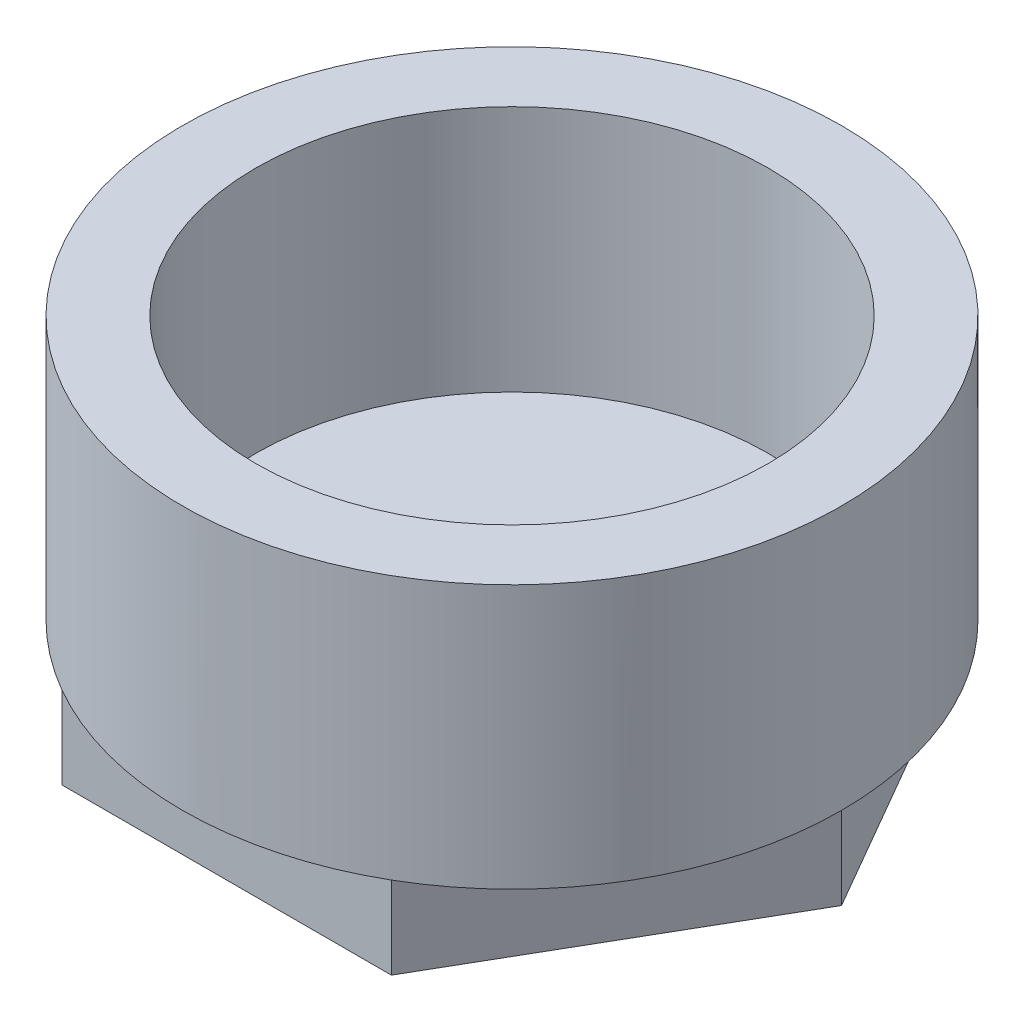
ISO-10303-21;
HEADER;
FILE_DESCRIPTION(('STEP AP214'),'2;1');
FILE_NAME('part.step','',(''),(''),'','','');
FILE_SCHEMA(('AUTOMOTIVE_DESIGN { 1 0 10303 214 1 1 1 1 }'));
ENDSEC;
DATA;
#1=APPLICATION_CONTEXT('core data for automotive mechanical design processes');
#2=APPLICATION_PROTOCOL_DEFINITION('international standard','automotive_design',2000,#1);
#3=PRODUCT_CONTEXT('',#1,'mechanical');
#4=PRODUCT('Part','Part','',(#3));
#5=PRODUCT_RELATED_PRODUCT_CATEGORY('part','',(#4));
#6=PRODUCT_DEFINITION_FORMATION('','',#4);
#7=PRODUCT_DEFINITION_CONTEXT('part definition',#1,'design');
#8=PRODUCT_DEFINITION('design','',#6,#7);
#9=PRODUCT_DEFINITION_SHAPE('','',#8);
#10=(LENGTH_UNIT() NAMED_UNIT(*) SI_UNIT(.MILLI.,.METRE.));
#11=(NAMED_UNIT(*) PLANE_ANGLE_UNIT() SI_UNIT($,.RADIAN.));
#12=(NAMED_UNIT(*) SI_UNIT($,.STERADIAN.) SOLID_ANGLE_UNIT());
#13=UNCERTAINTY_MEASURE_WITH_UNIT(LENGTH_MEASURE(1.E-05),#10,'distance_accuracy_value','');
#14=(GEOMETRIC_REPRESENTATION_CONTEXT(3) GLOBAL_UNCERTAINTY_ASSIGNED_CONTEXT((#13)) GLOBAL_UNIT_ASSIGNED_CONTEXT((#10,
#11,#12)) REPRESENTATION_CONTEXT('',''));
#15=CARTESIAN_POINT('',(0.,0.,0.));
#16=DIRECTION('',(0.,0.,1.));
#17=DIRECTION('',(1.,0.,0.));
#18=AXIS2_PLACEMENT_3D('',#15,#16,#17);
#19=CARTESIAN_POINT('',(0.,0.,0.));
#20=DIRECTION('',(0.,-1.,0.));
#21=DIRECTION('',(0.,0.,-1.));
#22=AXIS2_PLACEMENT_3D('',#19,#20,#21);
#23=CYLINDRICAL_SURFACE('',#22,20.);
#24=CARTESIAN_POINT('',(0.,21.,0.));
#25=DIRECTION('',(0.,-1.,0.));
#26=DIRECTION('',(0.,0.,-1.));
#27=AXIS2_PLACEMENT_3D('',#24,#25,#26);
#28=CIRCLE('',#27,20.);
#29=CARTESIAN_POINT('',(0.,21.,-20.));
#30=VERTEX_POINT('',#29);
#31=EDGE_CURVE('E11',#30,#30,#28,.T.);
#32=ORIENTED_EDGE('',*,*,#31,.T.);
#33=EDGE_LOOP('',(#32));
#34=FACE_BOUND('',#33,.T.);
#35=CARTESIAN_POINT('',(0.,5.,0.));
#36=DIRECTION('',(0.,-1.,0.));
#37=DIRECTION('',(0.,0.,-1.));
#38=AXIS2_PLACEMENT_3D('',#35,#36,#37);
#39=CIRCLE('',#38,20.);
#40=CARTESIAN_POINT('',(10.,5.,-17.3205080756888));
#41=VERTEX_POINT('',#40);
#42=CARTESIAN_POINT('',(20.,5.,0.));
#43=VERTEX_POINT('',#42);
#44=EDGE_CURVE('E106',#41,#43,#39,.T.);
#45=ORIENTED_EDGE('',*,*,#44,.F.);
#46=CARTESIAN_POINT('',(0.,5.,0.));
#47=DIRECTION('',(0.,-1.,0.));
#48=DIRECTION('',(0.,0.,-1.));
#49=AXIS2_PLACEMENT_3D('',#46,#47,#48);
#50=CIRCLE('',#49,20.);
#51=CARTESIAN_POINT('',(-10.,5.,-17.3205080756888));
#52=VERTEX_POINT('',#51);
#53=EDGE_CURVE('E115',#52,#41,#50,.T.);
#54=ORIENTED_EDGE('',*,*,#53,.F.);
#55=CARTESIAN_POINT('',(0.,5.,0.));
#56=DIRECTION('',(0.,-1.,0.));
#57=DIRECTION('',(0.,0.,-1.));
#58=AXIS2_PLACEMENT_3D('',#55,#56,#57);
#59=CIRCLE('',#58,20.);
#60=CARTESIAN_POINT('',(-20.,5.,0.));
#61=VERTEX_POINT('',#60);
#62=EDGE_CURVE('E342',#61,#52,#59,.T.);
#63=ORIENTED_EDGE('',*,*,#62,.F.);
#64=CARTESIAN_POINT('',(0.,5.,0.));
#65=DIRECTION('',(0.,-1.,0.));
#66=DIRECTION('',(0.,0.,-1.));
#67=AXIS2_PLACEMENT_3D('',#64,#65,#66);
#68=CIRCLE('',#67,20.);
#69=CARTESIAN_POINT('',(-10.,5.,17.3205080756888));
#70=VERTEX_POINT('',#69);
#71=EDGE_CURVE('E134',#70,#61,#68,.T.);
#72=ORIENTED_EDGE('',*,*,#71,.F.);
#73=CARTESIAN_POINT('',(0.,5.,0.));
#74=DIRECTION('',(0.,-1.,0.));
#75=DIRECTION('',(0.,0.,-1.));
#76=AXIS2_PLACEMENT_3D('',#73,#74,#75);
#77=CIRCLE('',#76,20.);
#78=CARTESIAN_POINT('',(10.,5.,17.3205080756888));
#79=VERTEX_POINT('',#78);
#80=EDGE_CURVE('E330',#79,#70,#77,.T.);
#81=ORIENTED_EDGE('',*,*,#80,.F.);
#82=CARTESIAN_POINT('',(0.,5.,0.));
#83=DIRECTION('',(0.,-1.,0.));
#84=DIRECTION('',(0.,0.,-1.));
#85=AXIS2_PLACEMENT_3D('',#82,#83,#84);
#86=CIRCLE('',#85,20.);
#87=EDGE_CURVE('E118',#43,#79,#86,.T.);
#88=ORIENTED_EDGE('',*,*,#87,.F.);
#89=EDGE_LOOP('',(#45,#54,#63,#72,#81,#88));
#90=FACE_BOUND('',#89,.T.);
#91=ADVANCED_FACE('F39',(#34,#90),#23,.T.);
#92=CARTESIAN_POINT('',(0.,0.,0.));
#93=DIRECTION('',(0.,1.,0.));
#94=DIRECTION('',(0.,0.,1.));
#95=AXIS2_PLACEMENT_3D('',#92,#93,#94);
#96=PLANE('',#95);
#97=CARTESIAN_POINT('',(0.,0.,0.));
#98=DIRECTION('',(0.,-1.,0.));
#99=DIRECTION('',(0.,0.,-1.));
#100=AXIS2_PLACEMENT_3D('',#97,#98,#99);
#101=CIRCLE('',#100,3.175);
#102=CARTESIAN_POINT('',(0.,0.,-3.175));
#103=VERTEX_POINT('',#102);
#104=EDGE_CURVE('E145',#103,#103,#101,.T.);
#105=ORIENTED_EDGE('',*,*,#104,.F.);
#106=EDGE_LOOP('',(#105));
#107=FACE_BOUND('',#106,.T.);
#108=CARTESIAN_POINT('',(10.,0.,0.));
#109=DIRECTION('',(0.,-1.,0.));
#110=DIRECTION('',(0.,0.,-1.));
#111=AXIS2_PLACEMENT_3D('',#108,#109,#110);
#112=CIRCLE('',#111,0.500000000000001);
#113=CARTESIAN_POINT('',(10.,0.,-0.500000000000001));
#114=VERTEX_POINT('',#113);
#115=EDGE_CURVE('E132',#114,#114,#112,.T.);
#116=ORIENTED_EDGE('',*,*,#115,.F.);
#117=EDGE_LOOP('',(#116));
#118=FACE_BOUND('',#117,.T.);
#119=DIRECTION('',(-1.,0.,0.));
#120=VECTOR('',#119,1.);
#121=CARTESIAN_POINT('',(0.,0.,-17.3205080756888));
#122=LINE('',#121,#120);
#123=CARTESIAN_POINT('',(10.,0.,-17.3205080756888));
#124=VERTEX_POINT('',#123);
#125=CARTESIAN_POINT('',(-10.,0.,-17.3205080756888));
#126=VERTEX_POINT('',#125);
#127=EDGE_CURVE('E124',#124,#126,#122,.T.);
#128=ORIENTED_EDGE('',*,*,#127,.F.);
#129=DIRECTION('',(-0.5,0.,-0.866025403784439));
#130=VECTOR('',#129,1.);
#131=CARTESIAN_POINT('',(15.,0.,-8.66025403784439));
#132=LINE('',#131,#130);
#133=CARTESIAN_POINT('',(20.,0.,0.));
#134=VERTEX_POINT('',#133);
#135=EDGE_CURVE('E95',#134,#124,#132,.T.);
#136=ORIENTED_EDGE('',*,*,#135,.F.);
#137=DIRECTION('',(0.5,0.,-0.866025403784439));
#138=VECTOR('',#137,1.);
#139=CARTESIAN_POINT('',(15.,0.,8.66025403784439));
#140=LINE('',#139,#138);
#141=CARTESIAN_POINT('',(10.,0.,17.3205080756888));
#142=VERTEX_POINT('',#141);
#143=EDGE_CURVE('E354',#142,#134,#140,.T.);
#144=ORIENTED_EDGE('',*,*,#143,.F.);
#145=DIRECTION('',(1.,0.,0.));
#146=VECTOR('',#145,1.);
#147=CARTESIAN_POINT('',(0.,0.,17.3205080756888));
#148=LINE('',#147,#146);
#149=CARTESIAN_POINT('',(-10.,0.,17.3205080756888));
#150=VERTEX_POINT('',#149);
#151=EDGE_CURVE('E108',#150,#142,#148,.T.);
#152=ORIENTED_EDGE('',*,*,#151,.F.);
#153=DIRECTION('',(0.5,0.,0.866025403784439));
#154=VECTOR('',#153,1.);
#155=CARTESIAN_POINT('',(-15.,0.,8.66025403784439));
#156=LINE('',#155,#154);
#157=CARTESIAN_POINT('',(-20.,0.,0.));
#158=VERTEX_POINT('',#157);
#159=EDGE_CURVE('E138',#158,#150,#156,.T.);
#160=ORIENTED_EDGE('',*,*,#159,.F.);
#161=DIRECTION('',(-0.5,0.,0.866025403784439));
#162=VECTOR('',#161,1.);
#163=CARTESIAN_POINT('',(-15.,0.,-8.66025403784439));
#164=LINE('',#163,#162);
#165=EDGE_CURVE('E64',#126,#158,#164,.T.);
#166=ORIENTED_EDGE('',*,*,#165,.F.);
#167=EDGE_LOOP('',(#128,#136,#144,#152,#160,#166));
#168=FACE_BOUND('',#167,.T.);
#169=ADVANCED_FACE('F41',(#107,#118,#168),#96,.F.);
#170=CARTESIAN_POINT('',(-20.,21.,0.));
#171=DIRECTION('',(0.,-1.,0.));
#172=DIRECTION('',(0.,0.,-1.));
#173=AXIS2_PLACEMENT_3D('',#170,#171,#172);
#174=PLANE('',#173);
#175=ORIENTED_EDGE('',*,*,#31,.F.);
#176=EDGE_LOOP('',(#175));
#177=FACE_BOUND('',#176,.T.);
#178=CARTESIAN_POINT('',(0.,21.,0.));
#179=DIRECTION('',(0.,-1.,0.));
#180=DIRECTION('',(0.,0.,-1.));
#181=AXIS2_PLACEMENT_3D('',#178,#179,#180);
#182=CIRCLE('',#181,15.5465);
#183=CARTESIAN_POINT('',(0.,21.,-15.5465));
#184=VERTEX_POINT('',#183);
#185=EDGE_CURVE('E48',#184,#184,#182,.T.);
#186=ORIENTED_EDGE('',*,*,#185,.T.);
#187=EDGE_LOOP('',(#186));
#188=FACE_BOUND('',#187,.T.);
#189=ADVANCED_FACE('F181',(#177,#188),#174,.F.);
#190=CARTESIAN_POINT('',(0.,0.,0.));
#191=DIRECTION('',(0.,-1.,0.));
#192=DIRECTION('',(0.,0.,-1.));
#193=AXIS2_PLACEMENT_3D('',#190,#191,#192);
#194=CYLINDRICAL_SURFACE('',#193,15.5465);
#195=ORIENTED_EDGE('',*,*,#185,.F.);
#196=EDGE_LOOP('',(#195));
#197=FACE_BOUND('',#196,.T.);
#198=CARTESIAN_POINT('',(0.,6.,0.));
#199=DIRECTION('',(0.,-1.,0.));
#200=DIRECTION('',(0.,0.,-1.));
#201=AXIS2_PLACEMENT_3D('',#198,#199,#200);
#202=CIRCLE('',#201,15.5465);
#203=CARTESIAN_POINT('',(0.,6.,-15.5465));
#204=VERTEX_POINT('',#203);
#205=EDGE_CURVE('E151',#204,#204,#202,.T.);
#206=ORIENTED_EDGE('',*,*,#205,.T.);
#207=EDGE_LOOP('',(#206));
#208=FACE_BOUND('',#207,.T.);
#209=ADVANCED_FACE('F186',(#197,#208),#194,.F.);
#210=CARTESIAN_POINT('',(-15.5465,6.,0.));
#211=DIRECTION('',(0.,-1.,0.));
#212=DIRECTION('',(0.,0.,-1.));
#213=AXIS2_PLACEMENT_3D('',#210,#211,#212);
#214=PLANE('',#213);
#215=CARTESIAN_POINT('',(0.,6.,0.));
#216=DIRECTION('',(0.,-1.,0.));
#217=DIRECTION('',(0.,0.,-1.));
#218=AXIS2_PLACEMENT_3D('',#215,#216,#217);
#219=CIRCLE('',#218,3.175);
#220=CARTESIAN_POINT('',(0.,6.,-3.175));
#221=VERTEX_POINT('',#220);
#222=EDGE_CURVE('E43',#221,#221,#219,.T.);
#223=ORIENTED_EDGE('',*,*,#222,.T.);
#224=EDGE_LOOP('',(#223));
#225=FACE_BOUND('',#224,.T.);
#226=CARTESIAN_POINT('',(10.,6.,0.));
#227=DIRECTION('',(0.,-1.,0.));
#228=DIRECTION('',(0.,0.,-1.));
#229=AXIS2_PLACEMENT_3D('',#226,#227,#228);
#230=CIRCLE('',#229,0.500000000000001);
#231=CARTESIAN_POINT('',(10.,6.,-0.500000000000001));
#232=VERTEX_POINT('',#231);
#233=EDGE_CURVE('E148',#232,#232,#230,.T.);
#234=ORIENTED_EDGE('',*,*,#233,.T.);
#235=EDGE_LOOP('',(#234));
#236=FACE_BOUND('',#235,.T.);
#237=ORIENTED_EDGE('',*,*,#205,.F.);
#238=EDGE_LOOP('',(#237));
#239=FACE_BOUND('',#238,.T.);
#240=ADVANCED_FACE('F161',(#225,#236,#239),#214,.F.);
#241=CARTESIAN_POINT('',(10.,10.,0.));
#242=DIRECTION('',(0.,-1.,0.));
#243=DIRECTION('',(0.,0.,-1.));
#244=AXIS2_PLACEMENT_3D('',#241,#242,#243);
#245=CYLINDRICAL_SURFACE('',#244,0.500000000000001);
#246=ORIENTED_EDGE('',*,*,#115,.T.);
#247=EDGE_LOOP('',(#246));
#248=FACE_BOUND('',#247,.T.);
#249=ORIENTED_EDGE('',*,*,#233,.F.);
#250=EDGE_LOOP('',(#249));
#251=FACE_BOUND('',#250,.T.);
#252=ADVANCED_FACE('F165',(#248,#251),#245,.F.);
#253=CARTESIAN_POINT('',(0.,10.,0.));
#254=DIRECTION('',(0.,-1.,0.));
#255=DIRECTION('',(0.,0.,-1.));
#256=AXIS2_PLACEMENT_3D('',#253,#254,#255);
#257=CYLINDRICAL_SURFACE('',#256,3.175);
#258=ORIENTED_EDGE('',*,*,#104,.T.);
#259=EDGE_LOOP('',(#258));
#260=FACE_BOUND('',#259,.T.);
#261=ORIENTED_EDGE('',*,*,#222,.F.);
#262=EDGE_LOOP('',(#261));
#263=FACE_BOUND('',#262,.T.);
#264=ADVANCED_FACE('F163',(#260,#263),#257,.F.);
#265=CARTESIAN_POINT('',(0.,5.,-17.3205080756888));
#266=DIRECTION('',(0.,0.,1.));
#267=DIRECTION('',(1.,0.,0.));
#268=AXIS2_PLACEMENT_3D('',#265,#266,#267);
#269=PLANE('',#268);
#270=ORIENTED_EDGE('',*,*,#127,.T.);
#271=DIRECTION('',(0.,-1.,0.));
#272=VECTOR('',#271,1.);
#273=CARTESIAN_POINT('',(-10.,5.,-17.3205080756888));
#274=LINE('',#273,#272);
#275=EDGE_CURVE('E100',#52,#126,#274,.T.);
#276=ORIENTED_EDGE('',*,*,#275,.F.);
#277=DIRECTION('',(-1.,0.,0.));
#278=VECTOR('',#277,1.);
#279=CARTESIAN_POINT('',(0.,5.,-17.3205080756888));
#280=LINE('',#279,#278);
#281=EDGE_CURVE('E101',#41,#52,#280,.T.);
#282=ORIENTED_EDGE('',*,*,#281,.F.);
#283=DIRECTION('',(0.,-1.,0.));
#284=VECTOR('',#283,1.);
#285=CARTESIAN_POINT('',(10.,5.,-17.3205080756888));
#286=LINE('',#285,#284);
#287=EDGE_CURVE('E92',#41,#124,#286,.T.);
#288=ORIENTED_EDGE('',*,*,#287,.T.);
#289=EDGE_LOOP('',(#270,#276,#282,#288));
#290=FACE_BOUND('',#289,.T.);
#291=ADVANCED_FACE('F126',(#290),#269,.F.);
#292=CARTESIAN_POINT('',(0.,5.,0.));
#293=DIRECTION('',(0.,-1.,0.));
#294=DIRECTION('',(0.,0.,-1.));
#295=AXIS2_PLACEMENT_3D('',#292,#293,#294);
#296=PLANE('',#295);
#297=ORIENTED_EDGE('',*,*,#53,.T.);
#298=ORIENTED_EDGE('',*,*,#281,.T.);
#299=EDGE_LOOP('',(#297,#298));
#300=FACE_BOUND('',#299,.T.);
#301=ADVANCED_FACE('F122',(#300),#296,.T.);
#302=CARTESIAN_POINT('',(-15.,5.,8.66025403784439));
#303=DIRECTION('',(0.866025403784439,0.,-0.5));
#304=DIRECTION('',(-0.5,0.,-0.866025403784439));
#305=AXIS2_PLACEMENT_3D('',#302,#303,#304);
#306=PLANE('',#305);
#307=ORIENTED_EDGE('',*,*,#159,.T.);
#308=DIRECTION('',(0.,-1.,0.));
#309=VECTOR('',#308,1.);
#310=CARTESIAN_POINT('',(-10.,5.,17.3205080756888));
#311=LINE('',#310,#309);
#312=EDGE_CURVE('E131',#70,#150,#311,.T.);
#313=ORIENTED_EDGE('',*,*,#312,.F.);
#314=DIRECTION('',(0.5,0.,0.866025403784439));
#315=VECTOR('',#314,1.);
#316=CARTESIAN_POINT('',(-15.,5.,8.66025403784439));
#317=LINE('',#316,#315);
#318=EDGE_CURVE('E137',#61,#70,#317,.T.);
#319=ORIENTED_EDGE('',*,*,#318,.F.);
#320=DIRECTION('',(0.,-1.,0.));
#321=VECTOR('',#320,1.);
#322=CARTESIAN_POINT('',(-20.,5.,0.));
#323=LINE('',#322,#321);
#324=EDGE_CURVE('E347',#61,#158,#323,.T.);
#325=ORIENTED_EDGE('',*,*,#324,.T.);
#326=EDGE_LOOP('',(#307,#313,#319,#325));
#327=FACE_BOUND('',#326,.T.);
#328=ADVANCED_FACE('F232',(#327),#306,.F.);
#329=CARTESIAN_POINT('',(0.,5.,0.));
#330=DIRECTION('',(0.,-1.,0.));
#331=DIRECTION('',(0.,0.,-1.));
#332=AXIS2_PLACEMENT_3D('',#329,#330,#331);
#333=PLANE('',#332);
#334=ORIENTED_EDGE('',*,*,#71,.T.);
#335=ORIENTED_EDGE('',*,*,#318,.T.);
#336=EDGE_LOOP('',(#334,#335));
#337=FACE_BOUND('',#336,.T.);
#338=ADVANCED_FACE('F241',(#337),#333,.T.);
#339=CARTESIAN_POINT('',(15.,5.,8.66025403784439));
#340=DIRECTION('',(-0.866025403784439,0.,-0.5));
#341=DIRECTION('',(-0.5,0.,0.866025403784439));
#342=AXIS2_PLACEMENT_3D('',#339,#340,#341);
#343=PLANE('',#342);
#344=ORIENTED_EDGE('',*,*,#143,.T.);
#345=DIRECTION('',(0.,-1.,0.));
#346=VECTOR('',#345,1.);
#347=CARTESIAN_POINT('',(20.,5.,0.));
#348=LINE('',#347,#346);
#349=EDGE_CURVE('E143',#43,#134,#348,.T.);
#350=ORIENTED_EDGE('',*,*,#349,.F.);
#351=DIRECTION('',(0.5,0.,-0.866025403784439));
#352=VECTOR('',#351,1.);
#353=CARTESIAN_POINT('',(15.,5.,8.66025403784439));
#354=LINE('',#353,#352);
#355=EDGE_CURVE('E356',#79,#43,#354,.T.);
#356=ORIENTED_EDGE('',*,*,#355,.F.);
#357=DIRECTION('',(0.,-1.,0.));
#358=VECTOR('',#357,1.);
#359=CARTESIAN_POINT('',(10.,5.,17.3205080756888));
#360=LINE('',#359,#358);
#361=EDGE_CURVE('E338',#79,#142,#360,.T.);
#362=ORIENTED_EDGE('',*,*,#361,.T.);
#363=EDGE_LOOP('',(#344,#350,#356,#362));
#364=FACE_BOUND('',#363,.T.);
#365=ADVANCED_FACE('F250',(#364),#343,.F.);
#366=CARTESIAN_POINT('',(0.,5.,0.));
#367=DIRECTION('',(0.,-1.,0.));
#368=DIRECTION('',(0.,0.,-1.));
#369=AXIS2_PLACEMENT_3D('',#366,#367,#368);
#370=PLANE('',#369);
#371=ORIENTED_EDGE('',*,*,#87,.T.);
#372=ORIENTED_EDGE('',*,*,#355,.T.);
#373=EDGE_LOOP('',(#371,#372));
#374=FACE_BOUND('',#373,.T.);
#375=ADVANCED_FACE('F260',(#374),#370,.T.);
#376=CARTESIAN_POINT('',(-15.,5.,-8.66025403784439));
#377=DIRECTION('',(0.866025403784439,0.,0.5));
#378=DIRECTION('',(0.5,0.,-0.866025403784439));
#379=AXIS2_PLACEMENT_3D('',#376,#377,#378);
#380=PLANE('',#379);
#381=ORIENTED_EDGE('',*,*,#165,.T.);
#382=ORIENTED_EDGE('',*,*,#324,.F.);
#383=DIRECTION('',(-0.5,0.,0.866025403784439));
#384=VECTOR('',#383,1.);
#385=CARTESIAN_POINT('',(-15.,5.,-8.66025403784439));
#386=LINE('',#385,#384);
#387=EDGE_CURVE('E345',#52,#61,#386,.T.);
#388=ORIENTED_EDGE('',*,*,#387,.F.);
#389=ORIENTED_EDGE('',*,*,#275,.T.);
#390=EDGE_LOOP('',(#381,#382,#388,#389));
#391=FACE_BOUND('',#390,.T.);
#392=ADVANCED_FACE('F270',(#391),#380,.F.);
#393=CARTESIAN_POINT('',(0.,5.,0.));
#394=DIRECTION('',(0.,-1.,0.));
#395=DIRECTION('',(0.,0.,-1.));
#396=AXIS2_PLACEMENT_3D('',#393,#394,#395);
#397=PLANE('',#396);
#398=ORIENTED_EDGE('',*,*,#62,.T.);
#399=ORIENTED_EDGE('',*,*,#387,.T.);
#400=EDGE_LOOP('',(#398,#399));
#401=FACE_BOUND('',#400,.T.);
#402=ADVANCED_FACE('F280',(#401),#397,.T.);
#403=CARTESIAN_POINT('',(0.,5.,17.3205080756888));
#404=DIRECTION('',(0.,0.,-1.));
#405=DIRECTION('',(-1.,0.,0.));
#406=AXIS2_PLACEMENT_3D('',#403,#404,#405);
#407=PLANE('',#406);
#408=ORIENTED_EDGE('',*,*,#151,.T.);
#409=ORIENTED_EDGE('',*,*,#361,.F.);
#410=DIRECTION('',(1.,0.,0.));
#411=VECTOR('',#410,1.);
#412=CARTESIAN_POINT('',(0.,5.,17.3205080756888));
#413=LINE('',#412,#411);
#414=EDGE_CURVE('E332',#70,#79,#413,.T.);
#415=ORIENTED_EDGE('',*,*,#414,.F.);
#416=ORIENTED_EDGE('',*,*,#312,.T.);
#417=EDGE_LOOP('',(#408,#409,#415,#416));
#418=FACE_BOUND('',#417,.T.);
#419=ADVANCED_FACE('F289',(#418),#407,.F.);
#420=CARTESIAN_POINT('',(0.,5.,0.));
#421=DIRECTION('',(0.,-1.,0.));
#422=DIRECTION('',(0.,0.,-1.));
#423=AXIS2_PLACEMENT_3D('',#420,#421,#422);
#424=PLANE('',#423);
#425=ORIENTED_EDGE('',*,*,#80,.T.);
#426=ORIENTED_EDGE('',*,*,#414,.T.);
#427=EDGE_LOOP('',(#425,#426));
#428=FACE_BOUND('',#427,.T.);
#429=ADVANCED_FACE('F299',(#428),#424,.T.);
#430=CARTESIAN_POINT('',(15.,5.,-8.66025403784439));
#431=DIRECTION('',(-0.866025403784439,0.,0.5));
#432=DIRECTION('',(0.5,0.,0.866025403784439));
#433=AXIS2_PLACEMENT_3D('',#430,#431,#432);
#434=PLANE('',#433);
#435=ORIENTED_EDGE('',*,*,#135,.T.);
#436=ORIENTED_EDGE('',*,*,#287,.F.);
#437=DIRECTION('',(-0.5,0.,-0.866025403784439));
#438=VECTOR('',#437,1.);
#439=CARTESIAN_POINT('',(15.,5.,-8.66025403784439));
#440=LINE('',#439,#438);
#441=EDGE_CURVE('E56',#43,#41,#440,.T.);
#442=ORIENTED_EDGE('',*,*,#441,.F.);
#443=ORIENTED_EDGE('',*,*,#349,.T.);
#444=EDGE_LOOP('',(#435,#436,#442,#443));
#445=FACE_BOUND('',#444,.T.);
#446=ADVANCED_FACE('F93',(#445),#434,.F.);
#447=CARTESIAN_POINT('',(0.,5.,0.));
#448=DIRECTION('',(0.,-1.,0.));
#449=DIRECTION('',(0.,0.,-1.));
#450=AXIS2_PLACEMENT_3D('',#447,#448,#449);
#451=PLANE('',#450);
#452=ORIENTED_EDGE('',*,*,#44,.T.);
#453=ORIENTED_EDGE('',*,*,#441,.T.);
#454=EDGE_LOOP('',(#452,#453));
#455=FACE_BOUND('',#454,.T.);
#456=ADVANCED_FACE('F105',(#455),#451,.T.);
#457=CLOSED_SHELL('',(#91,#169,#189,#209,#240,#252,#264,#291,#301,#328,#338,#365,#375,#392,#402,
#419,#429,#446,#456));
#458=MANIFOLD_SOLID_BREP('B2',#457);
#459=ADVANCED_BREP_SHAPE_REPRESENTATION('',(#18,#458),#14);
#460=SHAPE_DEFINITION_REPRESENTATION(#9,#459);
ENDSEC;
END-ISO-10303-21;
